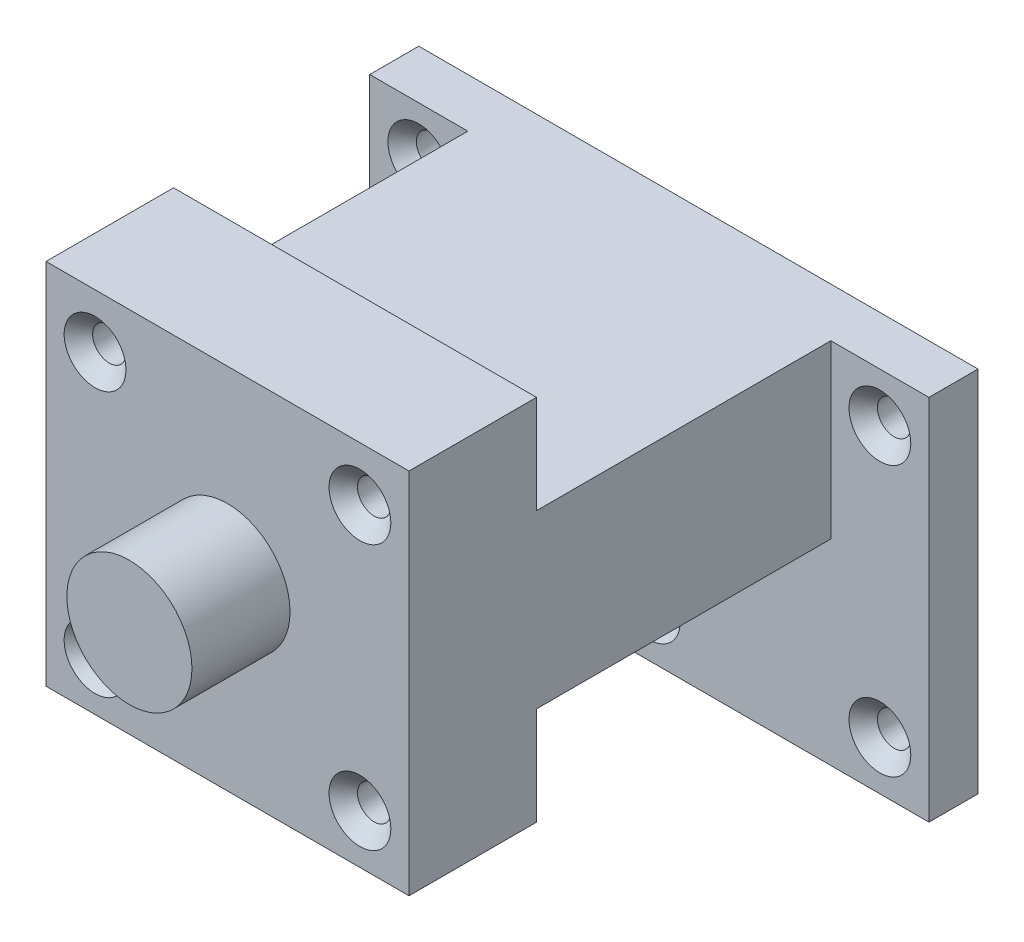
ISO-10303-21;
HEADER;
FILE_DESCRIPTION(('STEP AP214'),'2;1');
FILE_NAME('part.step','',(''),(''),'','','');
FILE_SCHEMA(('AUTOMOTIVE_DESIGN { 1 0 10303 214 1 1 1 1 }'));
ENDSEC;
DATA;
#1=APPLICATION_CONTEXT('core data for automotive mechanical design processes');
#2=APPLICATION_PROTOCOL_DEFINITION('international standard','automotive_design',2000,#1);
#3=PRODUCT_CONTEXT('',#1,'mechanical');
#4=PRODUCT('Part','Part','',(#3));
#5=PRODUCT_RELATED_PRODUCT_CATEGORY('part','',(#4));
#6=PRODUCT_DEFINITION_FORMATION('','',#4);
#7=PRODUCT_DEFINITION_CONTEXT('part definition',#1,'design');
#8=PRODUCT_DEFINITION('design','',#6,#7);
#9=PRODUCT_DEFINITION_SHAPE('','',#8);
#10=(LENGTH_UNIT() NAMED_UNIT(*) SI_UNIT(.MILLI.,.METRE.));
#11=(NAMED_UNIT(*) PLANE_ANGLE_UNIT() SI_UNIT($,.RADIAN.));
#12=(NAMED_UNIT(*) SI_UNIT($,.STERADIAN.) SOLID_ANGLE_UNIT());
#13=UNCERTAINTY_MEASURE_WITH_UNIT(LENGTH_MEASURE(1.E-05),#10,'distance_accuracy_value','');
#14=(GEOMETRIC_REPRESENTATION_CONTEXT(3) GLOBAL_UNCERTAINTY_ASSIGNED_CONTEXT((#13)) GLOBAL_UNIT_ASSIGNED_CONTEXT((#10,
#11,#12)) REPRESENTATION_CONTEXT('',''));
#15=CARTESIAN_POINT('',(0.,0.,0.));
#16=DIRECTION('',(0.,0.,1.));
#17=DIRECTION('',(1.,0.,0.));
#18=AXIS2_PLACEMENT_3D('',#15,#16,#17);
#19=CARTESIAN_POINT('',(0.,0.,0.));
#20=DIRECTION('',(0.,0.,-1.));
#21=DIRECTION('',(-1.,0.,0.));
#22=AXIS2_PLACEMENT_3D('',#19,#20,#21);
#23=PLANE('',#22);
#24=CARTESIAN_POINT('',(-5.00000000000001,-5.,0.));
#25=DIRECTION('',(0.,0.,-1.));
#26=DIRECTION('',(-1.,0.,0.));
#27=AXIS2_PLACEMENT_3D('',#24,#25,#26);
#28=CIRCLE('',#27,1.7);
#29=CARTESIAN_POINT('',(-6.7,-5.,0.));
#30=VERTEX_POINT('',#29);
#31=EDGE_CURVE('E867',#30,#30,#28,.F.);
#32=ORIENTED_EDGE('',*,*,#31,.T.);
#33=EDGE_LOOP('',(#32));
#34=FACE_BOUND('',#33,.T.);
#35=CARTESIAN_POINT('',(42.,-5.,0.));
#36=DIRECTION('',(0.,0.,-1.));
#37=DIRECTION('',(-1.,0.,0.));
#38=AXIS2_PLACEMENT_3D('',#35,#36,#37);
#39=CIRCLE('',#38,1.7);
#40=CARTESIAN_POINT('',(40.3,-5.,0.));
#41=VERTEX_POINT('',#40);
#42=EDGE_CURVE('E888',#41,#41,#39,.F.);
#43=ORIENTED_EDGE('',*,*,#42,.T.);
#44=EDGE_LOOP('',(#43));
#45=FACE_BOUND('',#44,.T.);
#46=DIRECTION('',(0.,1.,0.));
#47=VECTOR('',#46,1.);
#48=CARTESIAN_POINT('',(-10.,27.5,0.));
#49=LINE('',#48,#47);
#50=CARTESIAN_POINT('',(-10.,-10.,0.));
#51=VERTEX_POINT('',#50);
#52=CARTESIAN_POINT('',(-10.,27.5,0.));
#53=VERTEX_POINT('',#52);
#54=EDGE_CURVE('E178',#51,#53,#49,.T.);
#55=ORIENTED_EDGE('',*,*,#54,.T.);
#56=DIRECTION('',(1.,0.,0.));
#57=VECTOR('',#56,1.);
#58=CARTESIAN_POINT('',(37.,27.5,0.));
#59=LINE('',#58,#57);
#60=CARTESIAN_POINT('',(47.,27.5,0.));
#61=VERTEX_POINT('',#60);
#62=EDGE_CURVE('E197',#53,#61,#59,.T.);
#63=ORIENTED_EDGE('',*,*,#62,.T.);
#64=DIRECTION('',(0.,-1.,0.));
#65=VECTOR('',#64,1.);
#66=CARTESIAN_POINT('',(47.,27.5,0.));
#67=LINE('',#66,#65);
#68=CARTESIAN_POINT('',(47.,-10.,0.));
#69=VERTEX_POINT('',#68);
#70=EDGE_CURVE('E201',#61,#69,#67,.T.);
#71=ORIENTED_EDGE('',*,*,#70,.T.);
#72=DIRECTION('',(-1.,0.,0.));
#73=VECTOR('',#72,1.);
#74=CARTESIAN_POINT('',(47.,-10.,0.));
#75=LINE('',#74,#73);
#76=EDGE_CURVE('E206',#69,#51,#75,.T.);
#77=ORIENTED_EDGE('',*,*,#76,.T.);
#78=EDGE_LOOP('',(#55,#63,#71,#77));
#79=FACE_BOUND('',#78,.T.);
#80=CARTESIAN_POINT('',(42.,22.5,0.));
#81=DIRECTION('',(0.,0.,-1.));
#82=DIRECTION('',(-1.,0.,0.));
#83=AXIS2_PLACEMENT_3D('',#80,#81,#82);
#84=CIRCLE('',#83,1.7);
#85=CARTESIAN_POINT('',(40.3,22.5,0.));
#86=VERTEX_POINT('',#85);
#87=EDGE_CURVE('E842',#86,#86,#84,.F.);
#88=ORIENTED_EDGE('',*,*,#87,.T.);
#89=EDGE_LOOP('',(#88));
#90=FACE_BOUND('',#89,.T.);
#91=CARTESIAN_POINT('',(18.5,-5.,0.));
#92=DIRECTION('',(0.,0.,-1.));
#93=DIRECTION('',(-1.,0.,0.));
#94=AXIS2_PLACEMENT_3D('',#91,#92,#93);
#95=CIRCLE('',#94,1.7);
#96=CARTESIAN_POINT('',(16.8,-5.,0.));
#97=VERTEX_POINT('',#96);
#98=EDGE_CURVE('E846',#97,#97,#95,.F.);
#99=ORIENTED_EDGE('',*,*,#98,.T.);
#100=EDGE_LOOP('',(#99));
#101=FACE_BOUND('',#100,.T.);
#102=CARTESIAN_POINT('',(-5.00000000000001,22.5,0.));
#103=DIRECTION('',(0.,0.,-1.));
#104=DIRECTION('',(-1.,0.,0.));
#105=AXIS2_PLACEMENT_3D('',#102,#103,#104);
#106=CIRCLE('',#105,1.7);
#107=CARTESIAN_POINT('',(-6.7,22.5,0.));
#108=VERTEX_POINT('',#107);
#109=EDGE_CURVE('E849',#108,#108,#106,.F.);
#110=ORIENTED_EDGE('',*,*,#109,.T.);
#111=EDGE_LOOP('',(#110));
#112=FACE_BOUND('',#111,.T.);
#113=ADVANCED_FACE('F38',(#34,#45,#79,#90,#101,#112),#23,.T.);
#114=CARTESIAN_POINT('',(0.,0.,5.));
#115=DIRECTION('',(0.,0.,-1.));
#116=DIRECTION('',(-1.,0.,0.));
#117=AXIS2_PLACEMENT_3D('',#114,#115,#116);
#118=PLANE('',#117);
#119=CARTESIAN_POINT('',(-5.00000000000001,22.5,5.));
#120=DIRECTION('',(0.,0.,1.));
#121=DIRECTION('',(1.,0.,0.));
#122=AXIS2_PLACEMENT_3D('',#119,#120,#121);
#123=CIRCLE('',#122,3.15);
#124=CARTESIAN_POINT('',(-1.85000000000001,22.5,5.));
#125=VERTEX_POINT('',#124);
#126=EDGE_CURVE('E852',#125,#125,#123,.T.);
#127=ORIENTED_EDGE('',*,*,#126,.F.);
#128=EDGE_LOOP('',(#127));
#129=FACE_BOUND('',#128,.T.);
#130=CARTESIAN_POINT('',(-5.00000000000001,-5.,5.));
#131=DIRECTION('',(0.,0.,1.));
#132=DIRECTION('',(1.,0.,0.));
#133=AXIS2_PLACEMENT_3D('',#130,#131,#132);
#134=CIRCLE('',#133,3.15);
#135=CARTESIAN_POINT('',(-1.85000000000001,-5.,5.));
#136=VERTEX_POINT('',#135);
#137=EDGE_CURVE('E857',#136,#136,#134,.T.);
#138=ORIENTED_EDGE('',*,*,#137,.F.);
#139=EDGE_LOOP('',(#138));
#140=FACE_BOUND('',#139,.T.);
#141=CARTESIAN_POINT('',(18.5,-5.,5.));
#142=DIRECTION('',(0.,0.,1.));
#143=DIRECTION('',(1.,0.,0.));
#144=AXIS2_PLACEMENT_3D('',#141,#142,#143);
#145=CIRCLE('',#144,3.15);
#146=CARTESIAN_POINT('',(21.65,-5.,5.));
#147=VERTEX_POINT('',#146);
#148=EDGE_CURVE('E866',#147,#147,#145,.T.);
#149=ORIENTED_EDGE('',*,*,#148,.F.);
#150=EDGE_LOOP('',(#149));
#151=FACE_BOUND('',#150,.T.);
#152=CARTESIAN_POINT('',(42.,-5.,5.));
#153=DIRECTION('',(0.,0.,1.));
#154=DIRECTION('',(1.,0.,0.));
#155=AXIS2_PLACEMENT_3D('',#152,#153,#154);
#156=CIRCLE('',#155,3.15);
#157=CARTESIAN_POINT('',(45.15,-5.,5.));
#158=VERTEX_POINT('',#157);
#159=EDGE_CURVE('E877',#158,#158,#156,.T.);
#160=ORIENTED_EDGE('',*,*,#159,.F.);
#161=EDGE_LOOP('',(#160));
#162=FACE_BOUND('',#161,.T.);
#163=DIRECTION('',(1.,0.,0.));
#164=VECTOR('',#163,1.);
#165=CARTESIAN_POINT('',(0.,10.,5.));
#166=LINE('',#165,#164);
#167=CARTESIAN_POINT('',(0.,10.,5.));
#168=VERTEX_POINT('',#167);
#169=CARTESIAN_POINT('',(10.,10.,5.));
#170=VERTEX_POINT('',#169);
#171=EDGE_CURVE('E175',#168,#170,#166,.T.);
#172=ORIENTED_EDGE('',*,*,#171,.F.);
#173=DIRECTION('',(0.,-1.,0.));
#174=VECTOR('',#173,1.);
#175=CARTESIAN_POINT('',(0.,27.5,5.));
#176=LINE('',#175,#174);
#177=CARTESIAN_POINT('',(0.,27.5,5.));
#178=VERTEX_POINT('',#177);
#179=EDGE_CURVE('E155',#178,#168,#176,.T.);
#180=ORIENTED_EDGE('',*,*,#179,.F.);
#181=DIRECTION('',(1.,0.,0.));
#182=VECTOR('',#181,1.);
#183=CARTESIAN_POINT('',(0.,27.5,5.));
#184=LINE('',#183,#182);
#185=CARTESIAN_POINT('',(-10.,27.5,5.));
#186=VERTEX_POINT('',#185);
#187=EDGE_CURVE('E172',#186,#178,#184,.T.);
#188=ORIENTED_EDGE('',*,*,#187,.F.);
#189=DIRECTION('',(0.,1.,0.));
#190=VECTOR('',#189,1.);
#191=CARTESIAN_POINT('',(-10.,27.5,5.));
#192=LINE('',#191,#190);
#193=CARTESIAN_POINT('',(-10.,-10.,5.));
#194=VERTEX_POINT('',#193);
#195=EDGE_CURVE('E187',#194,#186,#192,.T.);
#196=ORIENTED_EDGE('',*,*,#195,.F.);
#197=DIRECTION('',(-1.,0.,0.));
#198=VECTOR('',#197,1.);
#199=CARTESIAN_POINT('',(47.,-10.,5.));
#200=LINE('',#199,#198);
#201=CARTESIAN_POINT('',(47.,-10.,5.));
#202=VERTEX_POINT('',#201);
#203=EDGE_CURVE('E193',#202,#194,#200,.T.);
#204=ORIENTED_EDGE('',*,*,#203,.F.);
#205=DIRECTION('',(0.,-1.,0.));
#206=VECTOR('',#205,1.);
#207=CARTESIAN_POINT('',(47.,27.5,5.));
#208=LINE('',#207,#206);
#209=CARTESIAN_POINT('',(47.,27.5,5.));
#210=VERTEX_POINT('',#209);
#211=EDGE_CURVE('E398',#210,#202,#208,.T.);
#212=ORIENTED_EDGE('',*,*,#211,.F.);
#213=DIRECTION('',(1.,0.,0.));
#214=VECTOR('',#213,1.);
#215=CARTESIAN_POINT('',(37.,27.5,5.));
#216=LINE('',#215,#214);
#217=CARTESIAN_POINT('',(37.,27.5,5.));
#218=VERTEX_POINT('',#217);
#219=EDGE_CURVE('E391',#218,#210,#216,.T.);
#220=ORIENTED_EDGE('',*,*,#219,.F.);
#221=DIRECTION('',(0.,1.,0.));
#222=VECTOR('',#221,1.);
#223=CARTESIAN_POINT('',(37.,27.5,5.));
#224=LINE('',#223,#222);
#225=CARTESIAN_POINT('',(37.,10.,5.));
#226=VERTEX_POINT('',#225);
#227=EDGE_CURVE('E388',#226,#218,#224,.T.);
#228=ORIENTED_EDGE('',*,*,#227,.F.);
#229=DIRECTION('',(1.,0.,0.));
#230=VECTOR('',#229,1.);
#231=CARTESIAN_POINT('',(37.,10.,5.));
#232=LINE('',#231,#230);
#233=CARTESIAN_POINT('',(27.,10.,5.));
#234=VERTEX_POINT('',#233);
#235=EDGE_CURVE('E316',#234,#226,#232,.T.);
#236=ORIENTED_EDGE('',*,*,#235,.F.);
#237=DIRECTION('',(0.,1.,0.));
#238=VECTOR('',#237,1.);
#239=CARTESIAN_POINT('',(27.,0.,5.));
#240=LINE('',#239,#238);
#241=CARTESIAN_POINT('',(27.,0.,5.));
#242=VERTEX_POINT('',#241);
#243=EDGE_CURVE('E163',#242,#234,#240,.T.);
#244=ORIENTED_EDGE('',*,*,#243,.F.);
#245=DIRECTION('',(1.,0.,0.));
#246=VECTOR('',#245,1.);
#247=CARTESIAN_POINT('',(37.,0.,5.));
#248=LINE('',#247,#246);
#249=CARTESIAN_POINT('',(10.,0.,5.));
#250=VERTEX_POINT('',#249);
#251=EDGE_CURVE('E177',#250,#242,#248,.T.);
#252=ORIENTED_EDGE('',*,*,#251,.F.);
#253=DIRECTION('',(0.,-1.,0.));
#254=VECTOR('',#253,1.);
#255=CARTESIAN_POINT('',(10.,0.,5.));
#256=LINE('',#255,#254);
#257=EDGE_CURVE('E288',#170,#250,#256,.T.);
#258=ORIENTED_EDGE('',*,*,#257,.F.);
#259=EDGE_LOOP('',(#172,#180,#188,#196,#204,#212,#220,#228,#236,#244,#252,#258));
#260=FACE_BOUND('',#259,.T.);
#261=CARTESIAN_POINT('',(42.,22.5,5.));
#262=DIRECTION('',(0.,0.,1.));
#263=DIRECTION('',(1.,0.,0.));
#264=AXIS2_PLACEMENT_3D('',#261,#262,#263);
#265=CIRCLE('',#264,3.15);
#266=CARTESIAN_POINT('',(45.15,22.5,5.));
#267=VERTEX_POINT('',#266);
#268=EDGE_CURVE('E887',#267,#267,#265,.T.);
#269=ORIENTED_EDGE('',*,*,#268,.F.);
#270=EDGE_LOOP('',(#269));
#271=FACE_BOUND('',#270,.T.);
#272=ADVANCED_FACE('F169',(#129,#140,#151,#162,#260,#271),#118,.F.);
#273=CARTESIAN_POINT('',(0.,0.,48.));
#274=DIRECTION('',(1.,0.,0.));
#275=DIRECTION('',(0.,0.,-1.));
#276=AXIS2_PLACEMENT_3D('',#273,#274,#275);
#277=PLANE('',#276);
#278=ORIENTED_EDGE('',*,*,#179,.T.);
#279=DIRECTION('',(0.,0.,-1.));
#280=VECTOR('',#279,1.);
#281=CARTESIAN_POINT('',(0.,10.,35.));
#282=LINE('',#281,#280);
#283=CARTESIAN_POINT('',(0.,10.,35.));
#284=VERTEX_POINT('',#283);
#285=EDGE_CURVE('E299',#284,#168,#282,.T.);
#286=ORIENTED_EDGE('',*,*,#285,.F.);
#287=DIRECTION('',(0.,1.,0.));
#288=VECTOR('',#287,1.);
#289=CARTESIAN_POINT('',(0.,0.,35.));
#290=LINE('',#289,#288);
#291=CARTESIAN_POINT('',(0.,0.,35.));
#292=VERTEX_POINT('',#291);
#293=EDGE_CURVE('E283',#292,#284,#290,.T.);
#294=ORIENTED_EDGE('',*,*,#293,.F.);
#295=DIRECTION('',(0.,0.,-1.));
#296=VECTOR('',#295,1.);
#297=CARTESIAN_POINT('',(0.,0.,48.));
#298=LINE('',#297,#296);
#299=CARTESIAN_POINT('',(0.,0.,48.));
#300=VERTEX_POINT('',#299);
#301=EDGE_CURVE('E42',#300,#292,#298,.T.);
#302=ORIENTED_EDGE('',*,*,#301,.F.);
#303=DIRECTION('',(0.,-1.,0.));
#304=VECTOR('',#303,1.);
#305=CARTESIAN_POINT('',(0.,0.,48.));
#306=LINE('',#305,#304);
#307=CARTESIAN_POINT('',(0.,37.5,48.));
#308=VERTEX_POINT('',#307);
#309=EDGE_CURVE('E347',#308,#300,#306,.T.);
#310=ORIENTED_EDGE('',*,*,#309,.F.);
#311=DIRECTION('',(0.,0.,-1.));
#312=VECTOR('',#311,1.);
#313=CARTESIAN_POINT('',(0.,37.5,48.));
#314=LINE('',#313,#312);
#315=CARTESIAN_POINT('',(0.,37.5,35.));
#316=VERTEX_POINT('',#315);
#317=EDGE_CURVE('E358',#308,#316,#314,.T.);
#318=ORIENTED_EDGE('',*,*,#317,.T.);
#319=DIRECTION('',(0.,1.,0.));
#320=VECTOR('',#319,1.);
#321=CARTESIAN_POINT('',(0.,37.5,35.));
#322=LINE('',#321,#320);
#323=CARTESIAN_POINT('',(0.,27.5,35.));
#324=VERTEX_POINT('',#323);
#325=EDGE_CURVE('E158',#324,#316,#322,.T.);
#326=ORIENTED_EDGE('',*,*,#325,.F.);
#327=DIRECTION('',(0.,0.,-1.));
#328=VECTOR('',#327,1.);
#329=CARTESIAN_POINT('',(0.,27.5,35.));
#330=LINE('',#329,#328);
#331=EDGE_CURVE('E152',#324,#178,#330,.T.);
#332=ORIENTED_EDGE('',*,*,#331,.T.);
#333=EDGE_LOOP('',(#278,#286,#294,#302,#310,#318,#326,#332));
#334=FACE_BOUND('',#333,.T.);
#335=ADVANCED_FACE('F40',(#334),#277,.F.);
#336=CARTESIAN_POINT('',(0.,0.,48.));
#337=DIRECTION('',(0.,1.,0.));
#338=DIRECTION('',(0.,0.,1.));
#339=AXIS2_PLACEMENT_3D('',#336,#337,#338);
#340=PLANE('',#339);
#341=ORIENTED_EDGE('',*,*,#251,.T.);
#342=DIRECTION('',(0.,0.,-1.));
#343=VECTOR('',#342,1.);
#344=CARTESIAN_POINT('',(27.,0.,35.));
#345=LINE('',#344,#343);
#346=CARTESIAN_POINT('',(27.,0.,35.));
#347=VERTEX_POINT('',#346);
#348=EDGE_CURVE('E328',#347,#242,#345,.T.);
#349=ORIENTED_EDGE('',*,*,#348,.F.);
#350=DIRECTION('',(-1.,0.,0.));
#351=VECTOR('',#350,1.);
#352=CARTESIAN_POINT('',(37.,0.,35.));
#353=LINE('',#352,#351);
#354=CARTESIAN_POINT('',(37.,0.,35.));
#355=VERTEX_POINT('',#354);
#356=EDGE_CURVE('E315',#355,#347,#353,.T.);
#357=ORIENTED_EDGE('',*,*,#356,.F.);
#358=DIRECTION('',(0.,0.,-1.));
#359=VECTOR('',#358,1.);
#360=CARTESIAN_POINT('',(37.,0.,48.));
#361=LINE('',#360,#359);
#362=CARTESIAN_POINT('',(37.,0.,48.));
#363=VERTEX_POINT('',#362);
#364=EDGE_CURVE('E364',#363,#355,#361,.T.);
#365=ORIENTED_EDGE('',*,*,#364,.F.);
#366=DIRECTION('',(1.,0.,0.));
#367=VECTOR('',#366,1.);
#368=CARTESIAN_POINT('',(0.,0.,48.));
#369=LINE('',#368,#367);
#370=EDGE_CURVE('E351',#300,#363,#369,.T.);
#371=ORIENTED_EDGE('',*,*,#370,.F.);
#372=ORIENTED_EDGE('',*,*,#301,.T.);
#373=DIRECTION('',(-1.,0.,0.));
#374=VECTOR('',#373,1.);
#375=CARTESIAN_POINT('',(0.,0.,35.));
#376=LINE('',#375,#374);
#377=CARTESIAN_POINT('',(10.,0.,35.));
#378=VERTEX_POINT('',#377);
#379=EDGE_CURVE('E296',#378,#292,#376,.T.);
#380=ORIENTED_EDGE('',*,*,#379,.F.);
#381=DIRECTION('',(0.,0.,-1.));
#382=VECTOR('',#381,1.);
#383=CARTESIAN_POINT('',(10.,0.,35.));
#384=LINE('',#383,#382);
#385=EDGE_CURVE('E273',#378,#250,#384,.T.);
#386=ORIENTED_EDGE('',*,*,#385,.T.);
#387=EDGE_LOOP('',(#341,#349,#357,#365,#371,#372,#380,#386));
#388=FACE_BOUND('',#387,.T.);
#389=ADVANCED_FACE('F375',(#388),#340,.F.);
#390=CARTESIAN_POINT('',(37.,0.,48.));
#391=DIRECTION('',(-1.,0.,0.));
#392=DIRECTION('',(0.,0.,1.));
#393=AXIS2_PLACEMENT_3D('',#390,#391,#392);
#394=PLANE('',#393);
#395=ORIENTED_EDGE('',*,*,#227,.T.);
#396=DIRECTION('',(0.,0.,-1.));
#397=VECTOR('',#396,1.);
#398=CARTESIAN_POINT('',(37.,27.5,35.));
#399=LINE('',#398,#397);
#400=CARTESIAN_POINT('',(37.,27.5,35.));
#401=VERTEX_POINT('',#400);
#402=EDGE_CURVE('E164',#401,#218,#399,.T.);
#403=ORIENTED_EDGE('',*,*,#402,.F.);
#404=DIRECTION('',(0.,-1.,0.));
#405=VECTOR('',#404,1.);
#406=CARTESIAN_POINT('',(37.,37.5,35.));
#407=LINE('',#406,#405);
#408=CARTESIAN_POINT('',(37.,37.5,35.));
#409=VERTEX_POINT('',#408);
#410=EDGE_CURVE('E268',#409,#401,#407,.T.);
#411=ORIENTED_EDGE('',*,*,#410,.F.);
#412=DIRECTION('',(0.,0.,-1.));
#413=VECTOR('',#412,1.);
#414=CARTESIAN_POINT('',(37.,37.5,48.));
#415=LINE('',#414,#413);
#416=CARTESIAN_POINT('',(37.,37.5,48.));
#417=VERTEX_POINT('',#416);
#418=EDGE_CURVE('E361',#417,#409,#415,.T.);
#419=ORIENTED_EDGE('',*,*,#418,.F.);
#420=DIRECTION('',(0.,1.,0.));
#421=VECTOR('',#420,1.);
#422=CARTESIAN_POINT('',(37.,0.,48.));
#423=LINE('',#422,#421);
#424=EDGE_CURVE('E60',#363,#417,#423,.T.);
#425=ORIENTED_EDGE('',*,*,#424,.F.);
#426=ORIENTED_EDGE('',*,*,#364,.T.);
#427=DIRECTION('',(0.,-1.,0.));
#428=VECTOR('',#427,1.);
#429=CARTESIAN_POINT('',(37.,0.,35.));
#430=LINE('',#429,#428);
#431=CARTESIAN_POINT('',(37.,10.,35.));
#432=VERTEX_POINT('',#431);
#433=EDGE_CURVE('E312',#432,#355,#430,.T.);
#434=ORIENTED_EDGE('',*,*,#433,.F.);
#435=DIRECTION('',(0.,0.,-1.));
#436=VECTOR('',#435,1.);
#437=CARTESIAN_POINT('',(37.,10.,35.));
#438=LINE('',#437,#436);
#439=EDGE_CURVE('E334',#432,#226,#438,.T.);
#440=ORIENTED_EDGE('',*,*,#439,.T.);
#441=EDGE_LOOP('',(#395,#403,#411,#419,#425,#426,#434,#440));
#442=FACE_BOUND('',#441,.T.);
#443=ADVANCED_FACE('F415',(#442),#394,.F.);
#444=CARTESIAN_POINT('',(0.,0.,35.));
#445=DIRECTION('',(0.,0.,1.));
#446=DIRECTION('',(1.,0.,0.));
#447=AXIS2_PLACEMENT_3D('',#444,#445,#446);
#448=PLANE('',#447);
#449=ORIENTED_EDGE('',*,*,#433,.T.);
#450=ORIENTED_EDGE('',*,*,#356,.T.);
#451=DIRECTION('',(0.,1.,0.));
#452=VECTOR('',#451,1.);
#453=CARTESIAN_POINT('',(27.,0.,35.));
#454=LINE('',#453,#452);
#455=CARTESIAN_POINT('',(27.,10.,35.));
#456=VERTEX_POINT('',#455);
#457=EDGE_CURVE('E320',#347,#456,#454,.T.);
#458=ORIENTED_EDGE('',*,*,#457,.T.);
#459=DIRECTION('',(1.,0.,0.));
#460=VECTOR('',#459,1.);
#461=CARTESIAN_POINT('',(37.,10.,35.));
#462=LINE('',#461,#460);
#463=EDGE_CURVE('E324',#456,#432,#462,.T.);
#464=ORIENTED_EDGE('',*,*,#463,.T.);
#465=EDGE_LOOP('',(#449,#450,#458,#464));
#466=FACE_BOUND('',#465,.T.);
#467=CARTESIAN_POINT('',(32.,5.,35.));
#468=DIRECTION('',(0.,0.,1.));
#469=DIRECTION('',(1.,0.,0.));
#470=AXIS2_PLACEMENT_3D('',#467,#468,#469);
#471=CIRCLE('',#470,1.7);
#472=CARTESIAN_POINT('',(33.7,5.,35.));
#473=VERTEX_POINT('',#472);
#474=EDGE_CURVE('E245',#473,#473,#471,.F.);
#475=ORIENTED_EDGE('',*,*,#474,.F.);
#476=EDGE_LOOP('',(#475));
#477=FACE_BOUND('',#476,.T.);
#478=ADVANCED_FACE('F421',(#466,#477),#448,.F.);
#479=CARTESIAN_POINT('',(0.,37.5,48.));
#480=DIRECTION('',(0.,-1.,0.));
#481=DIRECTION('',(0.,0.,-1.));
#482=AXIS2_PLACEMENT_3D('',#479,#480,#481);
#483=PLANE('',#482);
#484=DIRECTION('',(1.,0.,0.));
#485=VECTOR('',#484,1.);
#486=CARTESIAN_POINT('',(37.,37.5,35.));
#487=LINE('',#486,#485);
#488=EDGE_CURVE('E278',#316,#409,#487,.T.);
#489=ORIENTED_EDGE('',*,*,#488,.F.);
#490=ORIENTED_EDGE('',*,*,#317,.F.);
#491=DIRECTION('',(-1.,0.,0.));
#492=VECTOR('',#491,1.);
#493=CARTESIAN_POINT('',(0.,37.5,48.));
#494=LINE('',#493,#492);
#495=EDGE_CURVE('E55',#417,#308,#494,.T.);
#496=ORIENTED_EDGE('',*,*,#495,.F.);
#497=ORIENTED_EDGE('',*,*,#418,.T.);
#498=EDGE_LOOP('',(#489,#490,#496,#497));
#499=FACE_BOUND('',#498,.T.);
#500=ADVANCED_FACE('F428',(#499),#483,.F.);
#501=CARTESIAN_POINT('',(0.,0.,48.));
#502=DIRECTION('',(0.,0.,-1.));
#503=DIRECTION('',(-1.,0.,0.));
#504=AXIS2_PLACEMENT_3D('',#501,#502,#503);
#505=PLANE('',#504);
#506=CARTESIAN_POINT('',(5.,32.,48.));
#507=DIRECTION('',(0.,0.,1.));
#508=DIRECTION('',(1.,0.,0.));
#509=AXIS2_PLACEMENT_3D('',#506,#507,#508);
#510=CIRCLE('',#509,3.15);
#511=CARTESIAN_POINT('',(8.15,32.,48.));
#512=VERTEX_POINT('',#511);
#513=EDGE_CURVE('E215',#512,#512,#510,.T.);
#514=ORIENTED_EDGE('',*,*,#513,.F.);
#515=EDGE_LOOP('',(#514));
#516=FACE_BOUND('',#515,.T.);
#517=CARTESIAN_POINT('',(32.,32.,48.));
#518=DIRECTION('',(0.,0.,1.));
#519=DIRECTION('',(1.,0.,0.));
#520=AXIS2_PLACEMENT_3D('',#517,#518,#519);
#521=CIRCLE('',#520,3.15);
#522=CARTESIAN_POINT('',(35.15,32.,48.));
#523=VERTEX_POINT('',#522);
#524=EDGE_CURVE('E232',#523,#523,#521,.T.);
#525=ORIENTED_EDGE('',*,*,#524,.F.);
#526=EDGE_LOOP('',(#525));
#527=FACE_BOUND('',#526,.T.);
#528=CARTESIAN_POINT('',(32.,5.,48.));
#529=DIRECTION('',(0.,0.,1.));
#530=DIRECTION('',(1.,0.,0.));
#531=AXIS2_PLACEMENT_3D('',#528,#529,#530);
#532=CIRCLE('',#531,3.15);
#533=CARTESIAN_POINT('',(35.15,5.,48.));
#534=VERTEX_POINT('',#533);
#535=EDGE_CURVE('E244',#534,#534,#532,.T.);
#536=ORIENTED_EDGE('',*,*,#535,.F.);
#537=EDGE_LOOP('',(#536));
#538=FACE_BOUND('',#537,.T.);
#539=CARTESIAN_POINT('',(5.,5.,48.));
#540=DIRECTION('',(0.,0.,1.));
#541=DIRECTION('',(1.,0.,0.));
#542=AXIS2_PLACEMENT_3D('',#539,#540,#541);
#543=CIRCLE('',#542,3.15);
#544=CARTESIAN_POINT('',(8.15,5.,48.));
#545=VERTEX_POINT('',#544);
#546=EDGE_CURVE('E249',#545,#545,#543,.T.);
#547=ORIENTED_EDGE('',*,*,#546,.F.);
#548=EDGE_LOOP('',(#547));
#549=FACE_BOUND('',#548,.T.);
#550=CARTESIAN_POINT('',(18.5,19.,48.));
#551=DIRECTION('',(0.,0.,1.));
#552=DIRECTION('',(1.,0.,0.));
#553=AXIS2_PLACEMENT_3D('',#550,#551,#552);
#554=CIRCLE('',#553,6.375);
#555=CARTESIAN_POINT('',(24.875,19.,48.));
#556=VERTEX_POINT('',#555);
#557=EDGE_CURVE('E11',#556,#556,#554,.T.);
#558=ORIENTED_EDGE('',*,*,#557,.F.);
#559=EDGE_LOOP('',(#558));
#560=FACE_BOUND('',#559,.T.);
#561=ORIENTED_EDGE('',*,*,#309,.T.);
#562=ORIENTED_EDGE('',*,*,#370,.T.);
#563=ORIENTED_EDGE('',*,*,#424,.T.);
#564=ORIENTED_EDGE('',*,*,#495,.T.);
#565=EDGE_LOOP('',(#561,#562,#563,#564));
#566=FACE_BOUND('',#565,.T.);
#567=ADVANCED_FACE('F457',(#516,#527,#538,#549,#560,#566),#505,.F.);
#568=CARTESIAN_POINT('',(18.5,19.,58.));
#569=DIRECTION('',(0.,0.,-1.));
#570=DIRECTION('',(-1.,0.,0.));
#571=AXIS2_PLACEMENT_3D('',#568,#569,#570);
#572=CYLINDRICAL_SURFACE('',#571,6.375);
#573=CARTESIAN_POINT('',(18.5,19.,58.));
#574=DIRECTION('',(0.,0.,1.));
#575=DIRECTION('',(1.,0.,0.));
#576=AXIS2_PLACEMENT_3D('',#573,#574,#575);
#577=CIRCLE('',#576,6.375);
#578=CARTESIAN_POINT('',(24.875,19.,58.));
#579=VERTEX_POINT('',#578);
#580=EDGE_CURVE('E338',#579,#579,#577,.T.);
#581=ORIENTED_EDGE('',*,*,#580,.F.);
#582=EDGE_LOOP('',(#581));
#583=FACE_BOUND('',#582,.T.);
#584=ORIENTED_EDGE('',*,*,#557,.T.);
#585=EDGE_LOOP('',(#584));
#586=FACE_BOUND('',#585,.T.);
#587=ADVANCED_FACE('F663',(#583,#586),#572,.T.);
#588=CARTESIAN_POINT('',(18.5,19.,58.));
#589=DIRECTION('',(0.,0.,1.));
#590=DIRECTION('',(1.,0.,0.));
#591=AXIS2_PLACEMENT_3D('',#588,#589,#590);
#592=PLANE('',#591);
#593=ORIENTED_EDGE('',*,*,#580,.T.);
#594=EDGE_LOOP('',(#593));
#595=FACE_BOUND('',#594,.T.);
#596=ADVANCED_FACE('F440',(#595),#592,.T.);
#597=CARTESIAN_POINT('',(37.,27.5,35.));
#598=DIRECTION('',(0.,-1.,0.));
#599=DIRECTION('',(0.,0.,-1.));
#600=AXIS2_PLACEMENT_3D('',#597,#598,#599);
#601=PLANE('',#600);
#602=ORIENTED_EDGE('',*,*,#402,.T.);
#603=ORIENTED_EDGE('',*,*,#219,.T.);
#604=DIRECTION('',(0.,0.,-1.));
#605=VECTOR('',#604,1.);
#606=CARTESIAN_POINT('',(47.,27.5,5.));
#607=LINE('',#606,#605);
#608=EDGE_CURVE('E186',#210,#61,#607,.T.);
#609=ORIENTED_EDGE('',*,*,#608,.T.);
#610=ORIENTED_EDGE('',*,*,#62,.F.);
#611=DIRECTION('',(0.,0.,-1.));
#612=VECTOR('',#611,1.);
#613=CARTESIAN_POINT('',(-10.,27.5,5.));
#614=LINE('',#613,#612);
#615=EDGE_CURVE('E183',#186,#53,#614,.T.);
#616=ORIENTED_EDGE('',*,*,#615,.F.);
#617=ORIENTED_EDGE('',*,*,#187,.T.);
#618=ORIENTED_EDGE('',*,*,#331,.F.);
#619=DIRECTION('',(-1.,0.,0.));
#620=VECTOR('',#619,1.);
#621=CARTESIAN_POINT('',(37.,27.5,35.));
#622=LINE('',#621,#620);
#623=EDGE_CURVE('E272',#401,#324,#622,.T.);
#624=ORIENTED_EDGE('',*,*,#623,.F.);
#625=EDGE_LOOP('',(#602,#603,#609,#610,#616,#617,#618,#624));
#626=FACE_BOUND('',#625,.T.);
#627=ADVANCED_FACE('F181',(#626),#601,.F.);
#628=CARTESIAN_POINT('',(0.,0.,35.));
#629=DIRECTION('',(0.,0.,-1.));
#630=DIRECTION('',(-1.,0.,0.));
#631=AXIS2_PLACEMENT_3D('',#628,#629,#630);
#632=PLANE('',#631);
#633=CARTESIAN_POINT('',(5.,32.,35.));
#634=DIRECTION('',(0.,0.,1.));
#635=DIRECTION('',(1.,0.,0.));
#636=AXIS2_PLACEMENT_3D('',#633,#634,#635);
#637=CIRCLE('',#636,1.69999999999999);
#638=CARTESIAN_POINT('',(6.69999999999999,32.,35.));
#639=VERTEX_POINT('',#638);
#640=EDGE_CURVE('E228',#639,#639,#637,.T.);
#641=ORIENTED_EDGE('',*,*,#640,.T.);
#642=EDGE_LOOP('',(#641));
#643=FACE_BOUND('',#642,.T.);
#644=CARTESIAN_POINT('',(32.,32.,35.));
#645=DIRECTION('',(0.,0.,1.));
#646=DIRECTION('',(1.,0.,0.));
#647=AXIS2_PLACEMENT_3D('',#644,#645,#646);
#648=CIRCLE('',#647,1.69999999999999);
#649=CARTESIAN_POINT('',(33.7,32.,35.));
#650=VERTEX_POINT('',#649);
#651=EDGE_CURVE('E240',#650,#650,#648,.T.);
#652=ORIENTED_EDGE('',*,*,#651,.T.);
#653=EDGE_LOOP('',(#652));
#654=FACE_BOUND('',#653,.T.);
#655=ORIENTED_EDGE('',*,*,#410,.T.);
#656=ORIENTED_EDGE('',*,*,#623,.T.);
#657=ORIENTED_EDGE('',*,*,#325,.T.);
#658=ORIENTED_EDGE('',*,*,#488,.T.);
#659=EDGE_LOOP('',(#655,#656,#657,#658));
#660=FACE_BOUND('',#659,.T.);
#661=ADVANCED_FACE('F430',(#643,#654,#660),#632,.T.);
#662=CARTESIAN_POINT('',(37.,10.,35.));
#663=DIRECTION('',(0.,1.,0.));
#664=DIRECTION('',(0.,0.,1.));
#665=AXIS2_PLACEMENT_3D('',#662,#663,#664);
#666=PLANE('',#665);
#667=ORIENTED_EDGE('',*,*,#235,.T.);
#668=ORIENTED_EDGE('',*,*,#439,.F.);
#669=ORIENTED_EDGE('',*,*,#463,.F.);
#670=DIRECTION('',(0.,0.,-1.));
#671=VECTOR('',#670,1.);
#672=CARTESIAN_POINT('',(27.,10.,35.));
#673=LINE('',#672,#671);
#674=EDGE_CURVE('E339',#456,#234,#673,.T.);
#675=ORIENTED_EDGE('',*,*,#674,.T.);
#676=EDGE_LOOP('',(#667,#668,#669,#675));
#677=FACE_BOUND('',#676,.T.);
#678=ADVANCED_FACE('F419',(#677),#666,.F.);
#679=CARTESIAN_POINT('',(27.,0.,35.));
#680=DIRECTION('',(-1.,0.,0.));
#681=DIRECTION('',(0.,0.,1.));
#682=AXIS2_PLACEMENT_3D('',#679,#680,#681);
#683=PLANE('',#682);
#684=ORIENTED_EDGE('',*,*,#243,.T.);
#685=ORIENTED_EDGE('',*,*,#674,.F.);
#686=ORIENTED_EDGE('',*,*,#457,.F.);
#687=ORIENTED_EDGE('',*,*,#348,.T.);
#688=EDGE_LOOP('',(#684,#685,#686,#687));
#689=FACE_BOUND('',#688,.T.);
#690=ADVANCED_FACE('F425',(#689),#683,.F.);
#691=CARTESIAN_POINT('',(10.,0.,35.));
#692=DIRECTION('',(1.,0.,0.));
#693=DIRECTION('',(0.,0.,-1.));
#694=AXIS2_PLACEMENT_3D('',#691,#692,#693);
#695=PLANE('',#694);
#696=ORIENTED_EDGE('',*,*,#257,.T.);
#697=ORIENTED_EDGE('',*,*,#385,.F.);
#698=DIRECTION('',(0.,-1.,0.));
#699=VECTOR('',#698,1.);
#700=CARTESIAN_POINT('',(10.,0.,35.));
#701=LINE('',#700,#699);
#702=CARTESIAN_POINT('',(10.,10.,35.));
#703=VERTEX_POINT('',#702);
#704=EDGE_CURVE('E292',#703,#378,#701,.T.);
#705=ORIENTED_EDGE('',*,*,#704,.F.);
#706=DIRECTION('',(0.,0.,-1.));
#707=VECTOR('',#706,1.);
#708=CARTESIAN_POINT('',(10.,10.,35.));
#709=LINE('',#708,#707);
#710=EDGE_CURVE('E307',#703,#170,#709,.T.);
#711=ORIENTED_EDGE('',*,*,#710,.T.);
#712=EDGE_LOOP('',(#696,#697,#705,#711));
#713=FACE_BOUND('',#712,.T.);
#714=ADVANCED_FACE('F382',(#713),#695,.F.);
#715=CARTESIAN_POINT('',(0.,10.,35.));
#716=DIRECTION('',(0.,1.,0.));
#717=DIRECTION('',(-1.,0.,0.));
#718=AXIS2_PLACEMENT_3D('',#715,#716,#717);
#719=PLANE('',#718);
#720=ORIENTED_EDGE('',*,*,#171,.T.);
#721=ORIENTED_EDGE('',*,*,#710,.F.);
#722=DIRECTION('',(1.,0.,0.));
#723=VECTOR('',#722,1.);
#724=CARTESIAN_POINT('',(0.,10.,35.));
#725=LINE('',#724,#723);
#726=EDGE_CURVE('E287',#284,#703,#725,.T.);
#727=ORIENTED_EDGE('',*,*,#726,.F.);
#728=ORIENTED_EDGE('',*,*,#285,.T.);
#729=EDGE_LOOP('',(#720,#721,#727,#728));
#730=FACE_BOUND('',#729,.T.);
#731=ADVANCED_FACE('F652',(#730),#719,.F.);
#732=CARTESIAN_POINT('',(0.,0.,35.));
#733=DIRECTION('',(0.,0.,-1.));
#734=DIRECTION('',(-1.,0.,0.));
#735=AXIS2_PLACEMENT_3D('',#732,#733,#734);
#736=PLANE('',#735);
#737=CARTESIAN_POINT('',(5.,5.,35.));
#738=DIRECTION('',(0.,0.,1.));
#739=DIRECTION('',(1.,0.,0.));
#740=AXIS2_PLACEMENT_3D('',#737,#738,#739);
#741=CIRCLE('',#740,1.69999999999999);
#742=CARTESIAN_POINT('',(6.69999999999999,5.,35.));
#743=VERTEX_POINT('',#742);
#744=EDGE_CURVE('E264',#743,#743,#741,.T.);
#745=ORIENTED_EDGE('',*,*,#744,.T.);
#746=EDGE_LOOP('',(#745));
#747=FACE_BOUND('',#746,.T.);
#748=ORIENTED_EDGE('',*,*,#293,.T.);
#749=ORIENTED_EDGE('',*,*,#726,.T.);
#750=ORIENTED_EDGE('',*,*,#704,.T.);
#751=ORIENTED_EDGE('',*,*,#379,.T.);
#752=EDGE_LOOP('',(#748,#749,#750,#751));
#753=FACE_BOUND('',#752,.T.);
#754=ADVANCED_FACE('F379',(#747,#753),#736,.T.);
#755=CARTESIAN_POINT('',(5.,5.,48.));
#756=DIRECTION('',(0.,0.,1.));
#757=DIRECTION('',(1.,0.,0.));
#758=AXIS2_PLACEMENT_3D('',#755,#756,#757);
#759=CYLINDRICAL_SURFACE('',#758,1.7);
#760=ORIENTED_EDGE('',*,*,#744,.F.);
#761=EDGE_LOOP('',(#760));
#762=FACE_BOUND('',#761,.T.);
#763=CARTESIAN_POINT('',(5.,5.,46.55));
#764=DIRECTION('',(0.,0.,1.));
#765=DIRECTION('',(1.,0.,0.));
#766=AXIS2_PLACEMENT_3D('',#763,#764,#765);
#767=CIRCLE('',#766,1.7);
#768=CARTESIAN_POINT('',(6.7,5.,46.55));
#769=VERTEX_POINT('',#768);
#770=EDGE_CURVE('E260',#769,#769,#767,.T.);
#771=ORIENTED_EDGE('',*,*,#770,.T.);
#772=EDGE_LOOP('',(#771));
#773=FACE_BOUND('',#772,.T.);
#774=ADVANCED_FACE('F645',(#762,#773),#759,.F.);
#775=CARTESIAN_POINT('',(5.,5.,48.));
#776=DIRECTION('',(0.,0.,1.));
#777=DIRECTION('',(1.,0.,0.));
#778=AXIS2_PLACEMENT_3D('',#775,#776,#777);
#779=CONICAL_SURFACE('',#778,3.15,0.785398163397449);
#780=ORIENTED_EDGE('',*,*,#770,.F.);
#781=EDGE_LOOP('',(#780));
#782=FACE_BOUND('',#781,.T.);
#783=ORIENTED_EDGE('',*,*,#546,.T.);
#784=EDGE_LOOP('',(#783));
#785=FACE_BOUND('',#784,.T.);
#786=ADVANCED_FACE('F642',(#782,#785),#779,.F.);
#787=CARTESIAN_POINT('',(32.,5.,48.));
#788=DIRECTION('',(0.,0.,1.));
#789=DIRECTION('',(1.,0.,0.));
#790=AXIS2_PLACEMENT_3D('',#787,#788,#789);
#791=CYLINDRICAL_SURFACE('',#790,1.7);
#792=ORIENTED_EDGE('',*,*,#474,.T.);
#793=EDGE_LOOP('',(#792));
#794=FACE_BOUND('',#793,.T.);
#795=CARTESIAN_POINT('',(32.,5.,46.55));
#796=DIRECTION('',(0.,0.,1.));
#797=DIRECTION('',(1.,0.,0.));
#798=AXIS2_PLACEMENT_3D('',#795,#796,#797);
#799=CIRCLE('',#798,1.7);
#800=CARTESIAN_POINT('',(33.7,5.,46.55));
#801=VERTEX_POINT('',#800);
#802=EDGE_CURVE('E250',#801,#801,#799,.T.);
#803=ORIENTED_EDGE('',*,*,#802,.T.);
#804=EDGE_LOOP('',(#803));
#805=FACE_BOUND('',#804,.T.);
#806=ADVANCED_FACE('F638',(#794,#805),#791,.F.);
#807=CARTESIAN_POINT('',(32.,5.,48.));
#808=DIRECTION('',(0.,0.,1.));
#809=DIRECTION('',(1.,0.,0.));
#810=AXIS2_PLACEMENT_3D('',#807,#808,#809);
#811=CONICAL_SURFACE('',#810,3.15,0.785398163397448);
#812=ORIENTED_EDGE('',*,*,#802,.F.);
#813=EDGE_LOOP('',(#812));
#814=FACE_BOUND('',#813,.T.);
#815=ORIENTED_EDGE('',*,*,#535,.T.);
#816=EDGE_LOOP('',(#815));
#817=FACE_BOUND('',#816,.T.);
#818=ADVANCED_FACE('F634',(#814,#817),#811,.F.);
#819=CARTESIAN_POINT('',(32.,32.,48.));
#820=DIRECTION('',(0.,0.,1.));
#821=DIRECTION('',(1.,0.,0.));
#822=AXIS2_PLACEMENT_3D('',#819,#820,#821);
#823=CYLINDRICAL_SURFACE('',#822,1.7);
#824=ORIENTED_EDGE('',*,*,#651,.F.);
#825=EDGE_LOOP('',(#824));
#826=FACE_BOUND('',#825,.T.);
#827=CARTESIAN_POINT('',(32.,32.,46.55));
#828=DIRECTION('',(0.,0.,1.));
#829=DIRECTION('',(1.,0.,0.));
#830=AXIS2_PLACEMENT_3D('',#827,#828,#829);
#831=CIRCLE('',#830,1.7);
#832=CARTESIAN_POINT('',(33.7,32.,46.55));
#833=VERTEX_POINT('',#832);
#834=EDGE_CURVE('E236',#833,#833,#831,.T.);
#835=ORIENTED_EDGE('',*,*,#834,.T.);
#836=EDGE_LOOP('',(#835));
#837=FACE_BOUND('',#836,.T.);
#838=ADVANCED_FACE('F630',(#826,#837),#823,.F.);
#839=CARTESIAN_POINT('',(32.,32.,48.));
#840=DIRECTION('',(0.,0.,1.));
#841=DIRECTION('',(1.,0.,0.));
#842=AXIS2_PLACEMENT_3D('',#839,#840,#841);
#843=CONICAL_SURFACE('',#842,3.15,0.785398163397448);
#844=ORIENTED_EDGE('',*,*,#834,.F.);
#845=EDGE_LOOP('',(#844));
#846=FACE_BOUND('',#845,.T.);
#847=ORIENTED_EDGE('',*,*,#524,.T.);
#848=EDGE_LOOP('',(#847));
#849=FACE_BOUND('',#848,.T.);
#850=ADVANCED_FACE('F626',(#846,#849),#843,.F.);
#851=CARTESIAN_POINT('',(5.,32.,48.));
#852=DIRECTION('',(0.,0.,1.));
#853=DIRECTION('',(1.,0.,0.));
#854=AXIS2_PLACEMENT_3D('',#851,#852,#853);
#855=CYLINDRICAL_SURFACE('',#854,1.7);
#856=ORIENTED_EDGE('',*,*,#640,.F.);
#857=EDGE_LOOP('',(#856));
#858=FACE_BOUND('',#857,.T.);
#859=CARTESIAN_POINT('',(5.,32.,46.55));
#860=DIRECTION('',(0.,0.,1.));
#861=DIRECTION('',(1.,0.,0.));
#862=AXIS2_PLACEMENT_3D('',#859,#860,#861);
#863=CIRCLE('',#862,1.7);
#864=CARTESIAN_POINT('',(6.7,32.,46.55));
#865=VERTEX_POINT('',#864);
#866=EDGE_CURVE('E224',#865,#865,#863,.T.);
#867=ORIENTED_EDGE('',*,*,#866,.T.);
#868=EDGE_LOOP('',(#867));
#869=FACE_BOUND('',#868,.T.);
#870=ADVANCED_FACE('F622',(#858,#869),#855,.F.);
#871=CARTESIAN_POINT('',(5.,32.,48.));
#872=DIRECTION('',(0.,0.,1.));
#873=DIRECTION('',(1.,0.,0.));
#874=AXIS2_PLACEMENT_3D('',#871,#872,#873);
#875=CONICAL_SURFACE('',#874,3.15,0.785398163397449);
#876=ORIENTED_EDGE('',*,*,#866,.F.);
#877=EDGE_LOOP('',(#876));
#878=FACE_BOUND('',#877,.T.);
#879=ORIENTED_EDGE('',*,*,#513,.T.);
#880=EDGE_LOOP('',(#879));
#881=FACE_BOUND('',#880,.T.);
#882=ADVANCED_FACE('F616',(#878,#881),#875,.F.);
#883=CARTESIAN_POINT('',(-10.,27.5,5.));
#884=DIRECTION('',(-1.,0.,0.));
#885=DIRECTION('',(0.,-1.,0.));
#886=AXIS2_PLACEMENT_3D('',#883,#884,#885);
#887=PLANE('',#886);
#888=ORIENTED_EDGE('',*,*,#54,.F.);
#889=DIRECTION('',(0.,0.,-1.));
#890=VECTOR('',#889,1.);
#891=CARTESIAN_POINT('',(-10.,-10.,5.));
#892=LINE('',#891,#890);
#893=EDGE_CURVE('E216',#194,#51,#892,.T.);
#894=ORIENTED_EDGE('',*,*,#893,.F.);
#895=ORIENTED_EDGE('',*,*,#195,.T.);
#896=ORIENTED_EDGE('',*,*,#615,.T.);
#897=EDGE_LOOP('',(#888,#894,#895,#896));
#898=FACE_BOUND('',#897,.T.);
#899=ADVANCED_FACE('F613',(#898),#887,.T.);
#900=CARTESIAN_POINT('',(47.,-10.,5.));
#901=DIRECTION('',(0.,-1.,0.));
#902=DIRECTION('',(0.,0.,-1.));
#903=AXIS2_PLACEMENT_3D('',#900,#901,#902);
#904=PLANE('',#903);
#905=ORIENTED_EDGE('',*,*,#76,.F.);
#906=DIRECTION('',(0.,0.,-1.));
#907=VECTOR('',#906,1.);
#908=CARTESIAN_POINT('',(47.,-10.,5.));
#909=LINE('',#908,#907);
#910=EDGE_CURVE('E191',#202,#69,#909,.T.);
#911=ORIENTED_EDGE('',*,*,#910,.F.);
#912=ORIENTED_EDGE('',*,*,#203,.T.);
#913=ORIENTED_EDGE('',*,*,#893,.T.);
#914=EDGE_LOOP('',(#905,#911,#912,#913));
#915=FACE_BOUND('',#914,.T.);
#916=ADVANCED_FACE('F406',(#915),#904,.T.);
#917=CARTESIAN_POINT('',(47.,27.5,5.));
#918=DIRECTION('',(1.,0.,0.));
#919=DIRECTION('',(0.,0.,-1.));
#920=AXIS2_PLACEMENT_3D('',#917,#918,#919);
#921=PLANE('',#920);
#922=ORIENTED_EDGE('',*,*,#70,.F.);
#923=ORIENTED_EDGE('',*,*,#608,.F.);
#924=ORIENTED_EDGE('',*,*,#211,.T.);
#925=ORIENTED_EDGE('',*,*,#910,.T.);
#926=EDGE_LOOP('',(#922,#923,#924,#925));
#927=FACE_BOUND('',#926,.T.);
#928=ADVANCED_FACE('F412',(#927),#921,.T.);
#929=CARTESIAN_POINT('',(42.,22.5,5.));
#930=DIRECTION('',(0.,0.,1.));
#931=DIRECTION('',(1.,0.,0.));
#932=AXIS2_PLACEMENT_3D('',#929,#930,#931);
#933=CYLINDRICAL_SURFACE('',#932,1.7);
#934=ORIENTED_EDGE('',*,*,#87,.F.);
#935=EDGE_LOOP('',(#934));
#936=FACE_BOUND('',#935,.T.);
#937=CARTESIAN_POINT('',(42.,22.5,3.55));
#938=DIRECTION('',(0.,0.,1.));
#939=DIRECTION('',(1.,0.,0.));
#940=AXIS2_PLACEMENT_3D('',#937,#938,#939);
#941=CIRCLE('',#940,1.7);
#942=CARTESIAN_POINT('',(43.7,22.5,3.55));
#943=VERTEX_POINT('',#942);
#944=EDGE_CURVE('E202',#943,#943,#941,.T.);
#945=ORIENTED_EDGE('',*,*,#944,.T.);
#946=EDGE_LOOP('',(#945));
#947=FACE_BOUND('',#946,.T.);
#948=ADVANCED_FACE('F507',(#936,#947),#933,.F.);
#949=CARTESIAN_POINT('',(42.,22.5,5.));
#950=DIRECTION('',(0.,0.,1.));
#951=DIRECTION('',(1.,0.,0.));
#952=AXIS2_PLACEMENT_3D('',#949,#950,#951);
#953=CONICAL_SURFACE('',#952,3.15,0.785398163397447);
#954=ORIENTED_EDGE('',*,*,#944,.F.);
#955=EDGE_LOOP('',(#954));
#956=FACE_BOUND('',#955,.T.);
#957=ORIENTED_EDGE('',*,*,#268,.T.);
#958=EDGE_LOOP('',(#957));
#959=FACE_BOUND('',#958,.T.);
#960=ADVANCED_FACE('F511',(#956,#959),#953,.F.);
#961=CARTESIAN_POINT('',(42.,-5.,5.));
#962=DIRECTION('',(0.,0.,1.));
#963=DIRECTION('',(1.,0.,0.));
#964=AXIS2_PLACEMENT_3D('',#961,#962,#963);
#965=CYLINDRICAL_SURFACE('',#964,1.7);
#966=ORIENTED_EDGE('',*,*,#42,.F.);
#967=EDGE_LOOP('',(#966));
#968=FACE_BOUND('',#967,.T.);
#969=CARTESIAN_POINT('',(42.,-5.,3.55));
#970=DIRECTION('',(0.,0.,1.));
#971=DIRECTION('',(1.,0.,0.));
#972=AXIS2_PLACEMENT_3D('',#969,#970,#971);
#973=CIRCLE('',#972,1.7);
#974=CARTESIAN_POINT('',(43.7,-5.,3.55));
#975=VERTEX_POINT('',#974);
#976=EDGE_CURVE('E883',#975,#975,#973,.T.);
#977=ORIENTED_EDGE('',*,*,#976,.T.);
#978=EDGE_LOOP('',(#977));
#979=FACE_BOUND('',#978,.T.);
#980=ADVANCED_FACE('F519',(#968,#979),#965,.F.);
#981=CARTESIAN_POINT('',(42.,-5.,5.));
#982=DIRECTION('',(0.,0.,1.));
#983=DIRECTION('',(1.,0.,0.));
#984=AXIS2_PLACEMENT_3D('',#981,#982,#983);
#985=CONICAL_SURFACE('',#984,3.15,0.785398163397447);
#986=ORIENTED_EDGE('',*,*,#976,.F.);
#987=EDGE_LOOP('',(#986));
#988=FACE_BOUND('',#987,.T.);
#989=ORIENTED_EDGE('',*,*,#159,.T.);
#990=EDGE_LOOP('',(#989));
#991=FACE_BOUND('',#990,.T.);
#992=ADVANCED_FACE('F527',(#988,#991),#985,.F.);
#993=CARTESIAN_POINT('',(18.5,-5.,5.));
#994=DIRECTION('',(0.,0.,1.));
#995=DIRECTION('',(1.,0.,0.));
#996=AXIS2_PLACEMENT_3D('',#993,#994,#995);
#997=CYLINDRICAL_SURFACE('',#996,1.7);
#998=ORIENTED_EDGE('',*,*,#98,.F.);
#999=EDGE_LOOP('',(#998));
#1000=FACE_BOUND('',#999,.T.);
#1001=CARTESIAN_POINT('',(18.5,-5.,3.55));
#1002=DIRECTION('',(0.,0.,1.));
#1003=DIRECTION('',(1.,0.,0.));
#1004=AXIS2_PLACEMENT_3D('',#1001,#1002,#1003);
#1005=CIRCLE('',#1004,1.7);
#1006=CARTESIAN_POINT('',(20.2,-5.,3.55));
#1007=VERTEX_POINT('',#1006);
#1008=EDGE_CURVE('E873',#1007,#1007,#1005,.T.);
#1009=ORIENTED_EDGE('',*,*,#1008,.T.);
#1010=EDGE_LOOP('',(#1009));
#1011=FACE_BOUND('',#1010,.T.);
#1012=ADVANCED_FACE('F535',(#1000,#1011),#997,.F.);
#1013=CARTESIAN_POINT('',(18.5,-5.,5.));
#1014=DIRECTION('',(0.,0.,1.));
#1015=DIRECTION('',(1.,0.,0.));
#1016=AXIS2_PLACEMENT_3D('',#1013,#1014,#1015);
#1017=CONICAL_SURFACE('',#1016,3.15,0.785398163397448);
#1018=ORIENTED_EDGE('',*,*,#1008,.F.);
#1019=EDGE_LOOP('',(#1018));
#1020=FACE_BOUND('',#1019,.T.);
#1021=ORIENTED_EDGE('',*,*,#148,.T.);
#1022=EDGE_LOOP('',(#1021));
#1023=FACE_BOUND('',#1022,.T.);
#1024=ADVANCED_FACE('F543',(#1020,#1023),#1017,.F.);
#1025=CARTESIAN_POINT('',(-5.00000000000001,-5.,5.));
#1026=DIRECTION('',(0.,0.,1.));
#1027=DIRECTION('',(1.,0.,0.));
#1028=AXIS2_PLACEMENT_3D('',#1025,#1026,#1027);
#1029=CYLINDRICAL_SURFACE('',#1028,1.7);
#1030=ORIENTED_EDGE('',*,*,#31,.F.);
#1031=EDGE_LOOP('',(#1030));
#1032=FACE_BOUND('',#1031,.T.);
#1033=CARTESIAN_POINT('',(-5.00000000000001,-5.,3.55));
#1034=DIRECTION('',(0.,0.,1.));
#1035=DIRECTION('',(1.,0.,0.));
#1036=AXIS2_PLACEMENT_3D('',#1033,#1034,#1035);
#1037=CIRCLE('',#1036,1.7);
#1038=CARTESIAN_POINT('',(-3.30000000000001,-5.,3.55));
#1039=VERTEX_POINT('',#1038);
#1040=EDGE_CURVE('E862',#1039,#1039,#1037,.T.);
#1041=ORIENTED_EDGE('',*,*,#1040,.T.);
#1042=EDGE_LOOP('',(#1041));
#1043=FACE_BOUND('',#1042,.T.);
#1044=ADVANCED_FACE('F551',(#1032,#1043),#1029,.F.);
#1045=CARTESIAN_POINT('',(-5.00000000000001,-5.,5.));
#1046=DIRECTION('',(0.,0.,1.));
#1047=DIRECTION('',(1.,0.,0.));
#1048=AXIS2_PLACEMENT_3D('',#1045,#1046,#1047);
#1049=CONICAL_SURFACE('',#1048,3.15,0.785398163397448);
#1050=ORIENTED_EDGE('',*,*,#1040,.F.);
#1051=EDGE_LOOP('',(#1050));
#1052=FACE_BOUND('',#1051,.T.);
#1053=ORIENTED_EDGE('',*,*,#137,.T.);
#1054=EDGE_LOOP('',(#1053));
#1055=FACE_BOUND('',#1054,.T.);
#1056=ADVANCED_FACE('F559',(#1052,#1055),#1049,.F.);
#1057=CARTESIAN_POINT('',(-5.00000000000001,22.5,5.));
#1058=DIRECTION('',(0.,0.,1.));
#1059=DIRECTION('',(1.,0.,0.));
#1060=AXIS2_PLACEMENT_3D('',#1057,#1058,#1059);
#1061=CYLINDRICAL_SURFACE('',#1060,1.7);
#1062=ORIENTED_EDGE('',*,*,#109,.F.);
#1063=EDGE_LOOP('',(#1062));
#1064=FACE_BOUND('',#1063,.T.);
#1065=CARTESIAN_POINT('',(-5.00000000000001,22.5,3.55));
#1066=DIRECTION('',(0.,0.,1.));
#1067=DIRECTION('',(1.,0.,0.));
#1068=AXIS2_PLACEMENT_3D('',#1065,#1066,#1067);
#1069=CIRCLE('',#1068,1.7);
#1070=CARTESIAN_POINT('',(-3.30000000000001,22.5,3.55));
#1071=VERTEX_POINT('',#1070);
#1072=EDGE_CURVE('E851',#1071,#1071,#1069,.T.);
#1073=ORIENTED_EDGE('',*,*,#1072,.T.);
#1074=EDGE_LOOP('',(#1073));
#1075=FACE_BOUND('',#1074,.T.);
#1076=ADVANCED_FACE('F567',(#1064,#1075),#1061,.F.);
#1077=CARTESIAN_POINT('',(-5.00000000000001,22.5,5.));
#1078=DIRECTION('',(0.,0.,1.));
#1079=DIRECTION('',(1.,0.,0.));
#1080=AXIS2_PLACEMENT_3D('',#1077,#1078,#1079);
#1081=CONICAL_SURFACE('',#1080,3.15,0.785398163397448);
#1082=ORIENTED_EDGE('',*,*,#1072,.F.);
#1083=EDGE_LOOP('',(#1082));
#1084=FACE_BOUND('',#1083,.T.);
#1085=ORIENTED_EDGE('',*,*,#126,.T.);
#1086=EDGE_LOOP('',(#1085));
#1087=FACE_BOUND('',#1086,.T.);
#1088=ADVANCED_FACE('F575',(#1084,#1087),#1081,.F.);
#1089=CLOSED_SHELL('',(#113,#272,#335,#389,#443,#478,#500,#567,#587,#596,#627,#661,#678,#690,
#714,#731,#754,#774,#786,#806,#818,#838,#850,#870,#882,#899,#916,#928,#948,#960,#980,#992,#1012,
#1024,#1044,#1056,#1076,#1088));
#1090=MANIFOLD_SOLID_BREP('B2',#1089);
#1091=ADVANCED_BREP_SHAPE_REPRESENTATION('',(#18,#1090),#14);
#1092=SHAPE_DEFINITION_REPRESENTATION(#9,#1091);
ENDSEC;
END-ISO-10303-21;
